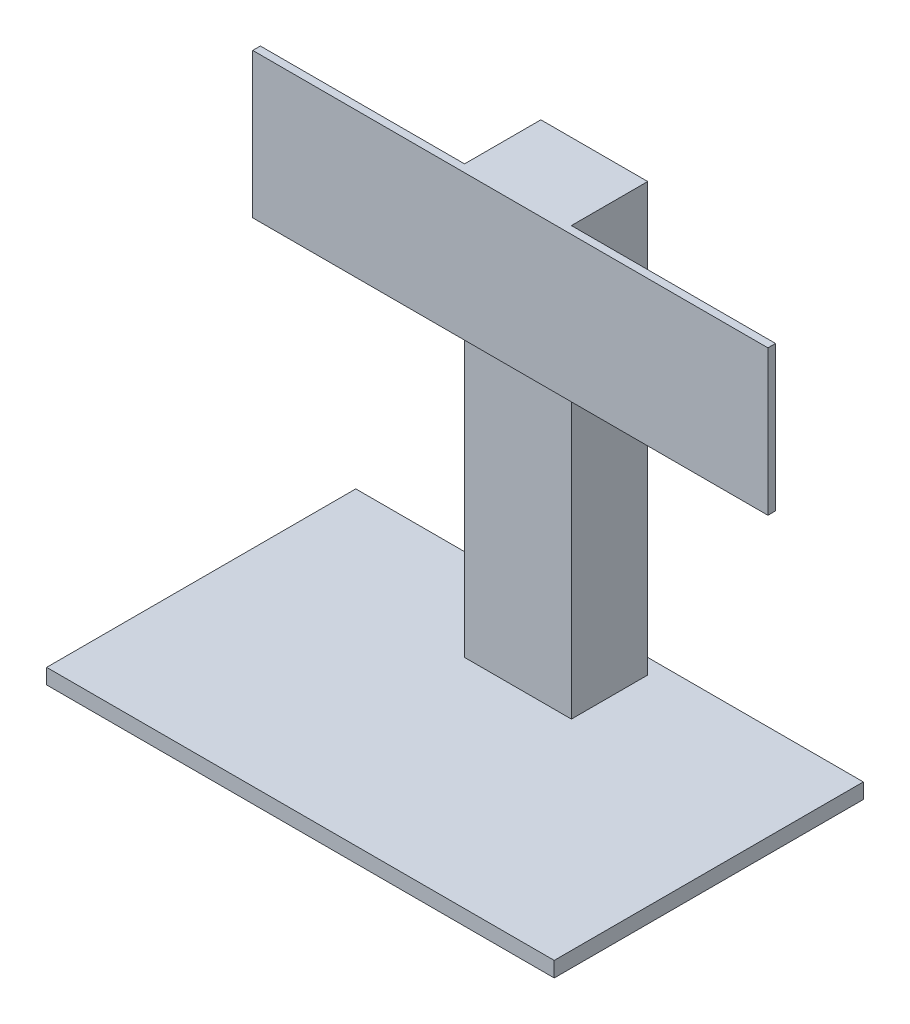
ISO-10303-21;
HEADER;
FILE_DESCRIPTION(('STEP AP214'),'2;1');
FILE_NAME('part.step','',(''),(''),'','','');
FILE_SCHEMA(('AUTOMOTIVE_DESIGN { 1 0 10303 214 1 1 1 1 }'));
ENDSEC;
DATA;
#1=APPLICATION_CONTEXT('core data for automotive mechanical design processes');
#2=APPLICATION_PROTOCOL_DEFINITION('international standard','automotive_design',2000,#1);
#3=PRODUCT_CONTEXT('',#1,'mechanical');
#4=PRODUCT('Part','Part','',(#3));
#5=PRODUCT_RELATED_PRODUCT_CATEGORY('part','',(#4));
#6=PRODUCT_DEFINITION_FORMATION('','',#4);
#7=PRODUCT_DEFINITION_CONTEXT('part definition',#1,'design');
#8=PRODUCT_DEFINITION('design','',#6,#7);
#9=PRODUCT_DEFINITION_SHAPE('','',#8);
#10=(LENGTH_UNIT() NAMED_UNIT(*) SI_UNIT(.MILLI.,.METRE.));
#11=(NAMED_UNIT(*) PLANE_ANGLE_UNIT() SI_UNIT($,.RADIAN.));
#12=(NAMED_UNIT(*) SI_UNIT($,.STERADIAN.) SOLID_ANGLE_UNIT());
#13=UNCERTAINTY_MEASURE_WITH_UNIT(LENGTH_MEASURE(1.E-05),#10,'distance_accuracy_value','');
#14=(GEOMETRIC_REPRESENTATION_CONTEXT(3) GLOBAL_UNCERTAINTY_ASSIGNED_CONTEXT((#13)) GLOBAL_UNIT_ASSIGNED_CONTEXT((#10,
#11,#12)) REPRESENTATION_CONTEXT('',''));
#15=CARTESIAN_POINT('',(0.,0.,0.));
#16=DIRECTION('',(0.,0.,1.));
#17=DIRECTION('',(1.,0.,0.));
#18=AXIS2_PLACEMENT_3D('',#15,#16,#17);
#19=CARTESIAN_POINT('',(-44.45,368.3,-52.3875));
#20=DIRECTION('',(0.,0.,-1.));
#21=DIRECTION('',(-1.,0.,0.));
#22=AXIS2_PLACEMENT_3D('',#19,#20,#21);
#23=PLANE('',#22);
#24=DIRECTION('',(1.,0.,0.));
#25=VECTOR('',#24,1.);
#26=CARTESIAN_POINT('',(-214.3125,247.65,-52.3875));
#27=LINE('',#26,#25);
#28=CARTESIAN_POINT('',(-44.45,247.65,-52.3875));
#29=VERTEX_POINT('',#28);
#30=CARTESIAN_POINT('',(44.45,247.65,-52.3875));
#31=VERTEX_POINT('',#30);
#32=EDGE_CURVE('E312',#29,#31,#27,.T.);
#33=ORIENTED_EDGE('',*,*,#32,.F.);
#34=DIRECTION('',(0.,-1.,0.));
#35=VECTOR('',#34,1.);
#36=CARTESIAN_POINT('',(-44.45,368.3,-52.3875));
#37=LINE('',#36,#35);
#38=CARTESIAN_POINT('',(-44.45,12.7,-52.3875));
#39=VERTEX_POINT('',#38);
#40=EDGE_CURVE('E58',#29,#39,#37,.T.);
#41=ORIENTED_EDGE('',*,*,#40,.T.);
#42=DIRECTION('',(1.,0.,0.));
#43=VECTOR('',#42,1.);
#44=CARTESIAN_POINT('',(-44.45,12.7,-52.3875));
#45=LINE('',#44,#43);
#46=CARTESIAN_POINT('',(44.45,12.7,-52.3875));
#47=VERTEX_POINT('',#46);
#48=EDGE_CURVE('E197',#39,#47,#45,.T.);
#49=ORIENTED_EDGE('',*,*,#48,.T.);
#50=DIRECTION('',(0.,-1.,0.));
#51=VECTOR('',#50,1.);
#52=CARTESIAN_POINT('',(44.45,368.3,-52.3875));
#53=LINE('',#52,#51);
#54=EDGE_CURVE('E203',#31,#47,#53,.T.);
#55=ORIENTED_EDGE('',*,*,#54,.F.);
#56=EDGE_LOOP('',(#33,#41,#49,#55));
#57=FACE_BOUND('',#56,.T.);
#58=ADVANCED_FACE('F41',(#57),#23,.F.);
#59=CARTESIAN_POINT('',(0.,12.7,0.));
#60=DIRECTION('',(0.,1.,0.));
#61=DIRECTION('',(0.,0.,1.));
#62=AXIS2_PLACEMENT_3D('',#59,#60,#61);
#63=PLANE('',#62);
#64=DIRECTION('',(0.,0.,1.));
#65=VECTOR('',#64,1.);
#66=CARTESIAN_POINT('',(-211.1375,12.7,128.5875));
#67=LINE('',#66,#65);
#68=CARTESIAN_POINT('',(-211.1375,12.7,-128.5875));
#69=VERTEX_POINT('',#68);
#70=CARTESIAN_POINT('',(-211.1375,12.7,128.5875));
#71=VERTEX_POINT('',#70);
#72=EDGE_CURVE('E227',#69,#71,#67,.T.);
#73=ORIENTED_EDGE('',*,*,#72,.T.);
#74=DIRECTION('',(1.,0.,0.));
#75=VECTOR('',#74,1.);
#76=CARTESIAN_POINT('',(211.1375,12.7,128.5875));
#77=LINE('',#76,#75);
#78=CARTESIAN_POINT('',(211.1375,12.7,128.5875));
#79=VERTEX_POINT('',#78);
#80=EDGE_CURVE('E95',#71,#79,#77,.T.);
#81=ORIENTED_EDGE('',*,*,#80,.T.);
#82=DIRECTION('',(0.,0.,-1.));
#83=VECTOR('',#82,1.);
#84=CARTESIAN_POINT('',(211.1375,12.7,128.5875));
#85=LINE('',#84,#83);
#86=CARTESIAN_POINT('',(211.1375,12.7,-128.5875));
#87=VERTEX_POINT('',#86);
#88=EDGE_CURVE('E231',#79,#87,#85,.T.);
#89=ORIENTED_EDGE('',*,*,#88,.T.);
#90=DIRECTION('',(-1.,0.,0.));
#91=VECTOR('',#90,1.);
#92=CARTESIAN_POINT('',(211.1375,12.7,-128.5875));
#93=LINE('',#92,#91);
#94=EDGE_CURVE('E67',#87,#69,#93,.T.);
#95=ORIENTED_EDGE('',*,*,#94,.T.);
#96=EDGE_LOOP('',(#73,#81,#89,#95));
#97=FACE_BOUND('',#96,.T.);
#98=DIRECTION('',(-1.,0.,0.));
#99=VECTOR('',#98,1.);
#100=CARTESIAN_POINT('',(-44.45,12.7,-115.8875));
#101=LINE('',#100,#99);
#102=CARTESIAN_POINT('',(44.45,12.7,-115.8875));
#103=VERTEX_POINT('',#102);
#104=CARTESIAN_POINT('',(-44.45,12.7,-115.8875));
#105=VERTEX_POINT('',#104);
#106=EDGE_CURVE('E187',#103,#105,#101,.T.);
#107=ORIENTED_EDGE('',*,*,#106,.F.);
#108=DIRECTION('',(0.,0.,-1.));
#109=VECTOR('',#108,1.);
#110=CARTESIAN_POINT('',(44.45,12.7,-52.3875));
#111=LINE('',#110,#109);
#112=EDGE_CURVE('E183',#47,#103,#111,.T.);
#113=ORIENTED_EDGE('',*,*,#112,.F.);
#114=ORIENTED_EDGE('',*,*,#48,.F.);
#115=DIRECTION('',(0.,0.,1.));
#116=VECTOR('',#115,1.);
#117=CARTESIAN_POINT('',(-44.45,12.7,-52.3875));
#118=LINE('',#117,#116);
#119=EDGE_CURVE('E207',#105,#39,#118,.T.);
#120=ORIENTED_EDGE('',*,*,#119,.F.);
#121=EDGE_LOOP('',(#107,#113,#114,#120));
#122=FACE_BOUND('',#121,.T.);
#123=ADVANCED_FACE('F271',(#97,#122),#63,.T.);
#124=CARTESIAN_POINT('',(-211.1375,12.7,128.5875));
#125=DIRECTION('',(1.,0.,0.));
#126=DIRECTION('',(0.,0.,-1.));
#127=AXIS2_PLACEMENT_3D('',#124,#125,#126);
#128=PLANE('',#127);
#129=DIRECTION('',(0.,0.,1.));
#130=VECTOR('',#129,1.);
#131=CARTESIAN_POINT('',(-211.1375,0.,128.5875));
#132=LINE('',#131,#130);
#133=CARTESIAN_POINT('',(-211.1375,0.,-128.5875));
#134=VERTEX_POINT('',#133);
#135=CARTESIAN_POINT('',(-211.1375,0.,128.5875));
#136=VERTEX_POINT('',#135);
#137=EDGE_CURVE('E226',#134,#136,#132,.T.);
#138=ORIENTED_EDGE('',*,*,#137,.T.);
#139=DIRECTION('',(0.,-1.,0.));
#140=VECTOR('',#139,1.);
#141=CARTESIAN_POINT('',(-211.1375,12.7,128.5875));
#142=LINE('',#141,#140);
#143=EDGE_CURVE('E11',#71,#136,#142,.T.);
#144=ORIENTED_EDGE('',*,*,#143,.F.);
#145=ORIENTED_EDGE('',*,*,#72,.F.);
#146=DIRECTION('',(0.,-1.,0.));
#147=VECTOR('',#146,1.);
#148=CARTESIAN_POINT('',(-211.1375,12.7,-128.5875));
#149=LINE('',#148,#147);
#150=EDGE_CURVE('E235',#69,#134,#149,.T.);
#151=ORIENTED_EDGE('',*,*,#150,.T.);
#152=EDGE_LOOP('',(#138,#144,#145,#151));
#153=FACE_BOUND('',#152,.T.);
#154=ADVANCED_FACE('F43',(#153),#128,.F.);
#155=CARTESIAN_POINT('',(211.1375,12.7,128.5875));
#156=DIRECTION('',(0.,0.,-1.));
#157=DIRECTION('',(-1.,0.,0.));
#158=AXIS2_PLACEMENT_3D('',#155,#156,#157);
#159=PLANE('',#158);
#160=DIRECTION('',(1.,0.,0.));
#161=VECTOR('',#160,1.);
#162=CARTESIAN_POINT('',(211.1375,0.,128.5875));
#163=LINE('',#162,#161);
#164=CARTESIAN_POINT('',(211.1375,0.,128.5875));
#165=VERTEX_POINT('',#164);
#166=EDGE_CURVE('E238',#136,#165,#163,.T.);
#167=ORIENTED_EDGE('',*,*,#166,.T.);
#168=DIRECTION('',(0.,-1.,0.));
#169=VECTOR('',#168,1.);
#170=CARTESIAN_POINT('',(211.1375,12.7,128.5875));
#171=LINE('',#170,#169);
#172=EDGE_CURVE('E49',#79,#165,#171,.T.);
#173=ORIENTED_EDGE('',*,*,#172,.F.);
#174=ORIENTED_EDGE('',*,*,#80,.F.);
#175=ORIENTED_EDGE('',*,*,#143,.T.);
#176=EDGE_LOOP('',(#167,#173,#174,#175));
#177=FACE_BOUND('',#176,.T.);
#178=ADVANCED_FACE('F268',(#177),#159,.F.);
#179=CARTESIAN_POINT('',(211.1375,12.7,128.5875));
#180=DIRECTION('',(-1.,0.,0.));
#181=DIRECTION('',(0.,0.,1.));
#182=AXIS2_PLACEMENT_3D('',#179,#180,#181);
#183=PLANE('',#182);
#184=DIRECTION('',(0.,0.,-1.));
#185=VECTOR('',#184,1.);
#186=CARTESIAN_POINT('',(211.1375,0.,128.5875));
#187=LINE('',#186,#185);
#188=CARTESIAN_POINT('',(211.1375,0.,-128.5875));
#189=VERTEX_POINT('',#188);
#190=EDGE_CURVE('E241',#165,#189,#187,.T.);
#191=ORIENTED_EDGE('',*,*,#190,.T.);
#192=DIRECTION('',(0.,-1.,0.));
#193=VECTOR('',#192,1.);
#194=CARTESIAN_POINT('',(211.1375,12.7,-128.5875));
#195=LINE('',#194,#193);
#196=EDGE_CURVE('E246',#87,#189,#195,.T.);
#197=ORIENTED_EDGE('',*,*,#196,.F.);
#198=ORIENTED_EDGE('',*,*,#88,.F.);
#199=ORIENTED_EDGE('',*,*,#172,.T.);
#200=EDGE_LOOP('',(#191,#197,#198,#199));
#201=FACE_BOUND('',#200,.T.);
#202=ADVANCED_FACE('F251',(#201),#183,.F.);
#203=CARTESIAN_POINT('',(211.1375,12.7,-128.5875));
#204=DIRECTION('',(0.,0.,1.));
#205=DIRECTION('',(1.,0.,0.));
#206=AXIS2_PLACEMENT_3D('',#203,#204,#205);
#207=PLANE('',#206);
#208=DIRECTION('',(-1.,0.,0.));
#209=VECTOR('',#208,1.);
#210=CARTESIAN_POINT('',(211.1375,0.,-128.5875));
#211=LINE('',#210,#209);
#212=EDGE_CURVE('E88',#189,#134,#211,.T.);
#213=ORIENTED_EDGE('',*,*,#212,.T.);
#214=ORIENTED_EDGE('',*,*,#150,.F.);
#215=ORIENTED_EDGE('',*,*,#94,.F.);
#216=ORIENTED_EDGE('',*,*,#196,.T.);
#217=EDGE_LOOP('',(#213,#214,#215,#216));
#218=FACE_BOUND('',#217,.T.);
#219=ADVANCED_FACE('F259',(#218),#207,.F.);
#220=CARTESIAN_POINT('',(0.,0.,0.));
#221=DIRECTION('',(0.,1.,0.));
#222=DIRECTION('',(0.,0.,1.));
#223=AXIS2_PLACEMENT_3D('',#220,#221,#222);
#224=PLANE('',#223);
#225=ORIENTED_EDGE('',*,*,#137,.F.);
#226=ORIENTED_EDGE('',*,*,#212,.F.);
#227=ORIENTED_EDGE('',*,*,#190,.F.);
#228=ORIENTED_EDGE('',*,*,#166,.F.);
#229=EDGE_LOOP('',(#225,#226,#227,#228));
#230=FACE_BOUND('',#229,.T.);
#231=ADVANCED_FACE('F255',(#230),#224,.F.);
#232=CARTESIAN_POINT('',(44.45,368.3,-52.3875));
#233=DIRECTION('',(-1.,0.,0.));
#234=DIRECTION('',(0.,0.,1.));
#235=AXIS2_PLACEMENT_3D('',#232,#233,#234);
#236=PLANE('',#235);
#237=ORIENTED_EDGE('',*,*,#112,.T.);
#238=DIRECTION('',(0.,-1.,0.));
#239=VECTOR('',#238,1.);
#240=CARTESIAN_POINT('',(44.45,368.3,-115.8875));
#241=LINE('',#240,#239);
#242=CARTESIAN_POINT('',(44.45,368.3,-115.8875));
#243=VERTEX_POINT('',#242);
#244=EDGE_CURVE('E223',#243,#103,#241,.T.);
#245=ORIENTED_EDGE('',*,*,#244,.F.);
#246=DIRECTION('',(0.,0.,-1.));
#247=VECTOR('',#246,1.);
#248=CARTESIAN_POINT('',(44.45,368.3,-52.3875));
#249=LINE('',#248,#247);
#250=CARTESIAN_POINT('',(44.45,368.3,-52.3875));
#251=VERTEX_POINT('',#250);
#252=EDGE_CURVE('E193',#251,#243,#249,.T.);
#253=ORIENTED_EDGE('',*,*,#252,.F.);
#254=EDGE_CURVE('E212',#251,#31,#53,.T.);
#255=ORIENTED_EDGE('',*,*,#254,.T.);
#256=ORIENTED_EDGE('',*,*,#54,.T.);
#257=EDGE_LOOP('',(#237,#245,#253,#255,#256));
#258=FACE_BOUND('',#257,.T.);
#259=ADVANCED_FACE('F266',(#258),#236,.F.);
#260=CARTESIAN_POINT('',(-44.45,368.3,-115.8875));
#261=DIRECTION('',(0.,0.,1.));
#262=DIRECTION('',(1.,0.,0.));
#263=AXIS2_PLACEMENT_3D('',#260,#261,#262);
#264=PLANE('',#263);
#265=ORIENTED_EDGE('',*,*,#106,.T.);
#266=DIRECTION('',(0.,-1.,0.));
#267=VECTOR('',#266,1.);
#268=CARTESIAN_POINT('',(-44.45,368.3,-115.8875));
#269=LINE('',#268,#267);
#270=CARTESIAN_POINT('',(-44.45,368.3,-115.8875));
#271=VERTEX_POINT('',#270);
#272=EDGE_CURVE('E219',#271,#105,#269,.T.);
#273=ORIENTED_EDGE('',*,*,#272,.F.);
#274=DIRECTION('',(-1.,0.,0.));
#275=VECTOR('',#274,1.);
#276=CARTESIAN_POINT('',(-44.45,368.3,-115.8875));
#277=LINE('',#276,#275);
#278=EDGE_CURVE('E196',#243,#271,#277,.T.);
#279=ORIENTED_EDGE('',*,*,#278,.F.);
#280=ORIENTED_EDGE('',*,*,#244,.T.);
#281=EDGE_LOOP('',(#265,#273,#279,#280));
#282=FACE_BOUND('',#281,.T.);
#283=ADVANCED_FACE('F283',(#282),#264,.F.);
#284=CARTESIAN_POINT('',(-44.45,368.3,-52.3875));
#285=DIRECTION('',(1.,0.,0.));
#286=DIRECTION('',(0.,0.,-1.));
#287=AXIS2_PLACEMENT_3D('',#284,#285,#286);
#288=PLANE('',#287);
#289=ORIENTED_EDGE('',*,*,#119,.T.);
#290=ORIENTED_EDGE('',*,*,#40,.F.);
#291=CARTESIAN_POINT('',(-44.45,368.3,-52.3875));
#292=VERTEX_POINT('',#291);
#293=EDGE_CURVE('E216',#292,#29,#37,.T.);
#294=ORIENTED_EDGE('',*,*,#293,.F.);
#295=DIRECTION('',(0.,0.,1.));
#296=VECTOR('',#295,1.);
#297=CARTESIAN_POINT('',(-44.45,368.3,-52.3875));
#298=LINE('',#297,#296);
#299=EDGE_CURVE('E200',#271,#292,#298,.T.);
#300=ORIENTED_EDGE('',*,*,#299,.F.);
#301=ORIENTED_EDGE('',*,*,#272,.T.);
#302=EDGE_LOOP('',(#289,#290,#294,#300,#301));
#303=FACE_BOUND('',#302,.T.);
#304=ADVANCED_FACE('F280',(#303),#288,.F.);
#305=CARTESIAN_POINT('',(0.,368.3,0.));
#306=DIRECTION('',(0.,-1.,0.));
#307=DIRECTION('',(0.,0.,-1.));
#308=AXIS2_PLACEMENT_3D('',#305,#306,#307);
#309=PLANE('',#308);
#310=ORIENTED_EDGE('',*,*,#252,.T.);
#311=ORIENTED_EDGE('',*,*,#278,.T.);
#312=ORIENTED_EDGE('',*,*,#299,.T.);
#313=DIRECTION('',(-1.,0.,0.));
#314=VECTOR('',#313,1.);
#315=CARTESIAN_POINT('',(-214.3125,368.3,-52.3875));
#316=LINE('',#315,#314);
#317=CARTESIAN_POINT('',(-214.3125,368.3,-52.3875));
#318=VERTEX_POINT('',#317);
#319=EDGE_CURVE('E303',#292,#318,#316,.T.);
#320=ORIENTED_EDGE('',*,*,#319,.T.);
#321=DIRECTION('',(0.,0.,-1.));
#322=VECTOR('',#321,1.);
#323=CARTESIAN_POINT('',(-214.3125,368.3,-46.0375));
#324=LINE('',#323,#322);
#325=CARTESIAN_POINT('',(-214.3125,368.3,-46.0375));
#326=VERTEX_POINT('',#325);
#327=EDGE_CURVE('E164',#326,#318,#324,.T.);
#328=ORIENTED_EDGE('',*,*,#327,.F.);
#329=DIRECTION('',(-1.,0.,0.));
#330=VECTOR('',#329,1.);
#331=CARTESIAN_POINT('',(-214.3125,368.3,-46.0375));
#332=LINE('',#331,#330);
#333=CARTESIAN_POINT('',(214.3125,368.3,-46.0375));
#334=VERTEX_POINT('',#333);
#335=EDGE_CURVE('E156',#334,#326,#332,.T.);
#336=ORIENTED_EDGE('',*,*,#335,.F.);
#337=DIRECTION('',(0.,0.,-1.));
#338=VECTOR('',#337,1.);
#339=CARTESIAN_POINT('',(214.3125,368.3,-46.0375));
#340=LINE('',#339,#338);
#341=CARTESIAN_POINT('',(214.3125,368.3,-52.3875));
#342=VERTEX_POINT('',#341);
#343=EDGE_CURVE('E161',#334,#342,#340,.T.);
#344=ORIENTED_EDGE('',*,*,#343,.T.);
#345=EDGE_CURVE('E304',#342,#251,#316,.T.);
#346=ORIENTED_EDGE('',*,*,#345,.T.);
#347=EDGE_LOOP('',(#310,#311,#312,#320,#328,#336,#344,#346));
#348=FACE_BOUND('',#347,.T.);
#349=ADVANCED_FACE('F159',(#348),#309,.F.);
#350=CARTESIAN_POINT('',(0.,0.,-52.3875));
#351=DIRECTION('',(0.,0.,-1.));
#352=DIRECTION('',(-1.,0.,0.));
#353=AXIS2_PLACEMENT_3D('',#350,#351,#352);
#354=PLANE('',#353);
#355=ORIENTED_EDGE('',*,*,#254,.F.);
#356=ORIENTED_EDGE('',*,*,#345,.F.);
#357=DIRECTION('',(0.,1.,0.));
#358=VECTOR('',#357,1.);
#359=CARTESIAN_POINT('',(214.3125,247.65,-52.3875));
#360=LINE('',#359,#358);
#361=CARTESIAN_POINT('',(214.3125,247.65,-52.3875));
#362=VERTEX_POINT('',#361);
#363=EDGE_CURVE('E182',#362,#342,#360,.T.);
#364=ORIENTED_EDGE('',*,*,#363,.F.);
#365=EDGE_CURVE('E308',#31,#362,#27,.T.);
#366=ORIENTED_EDGE('',*,*,#365,.F.);
#367=EDGE_LOOP('',(#355,#356,#364,#366));
#368=FACE_BOUND('',#367,.T.);
#369=ADVANCED_FACE('F307',(#368),#354,.T.);
#370=ORIENTED_EDGE('',*,*,#293,.T.);
#371=CARTESIAN_POINT('',(-214.3125,247.65,-52.3875));
#372=VERTEX_POINT('',#371);
#373=EDGE_CURVE('E178',#372,#29,#27,.T.);
#374=ORIENTED_EDGE('',*,*,#373,.F.);
#375=DIRECTION('',(0.,-1.,0.));
#376=VECTOR('',#375,1.);
#377=CARTESIAN_POINT('',(-214.3125,247.65,-52.3875));
#378=LINE('',#377,#376);
#379=EDGE_CURVE('E313',#318,#372,#378,.T.);
#380=ORIENTED_EDGE('',*,*,#379,.F.);
#381=ORIENTED_EDGE('',*,*,#319,.F.);
#382=EDGE_LOOP('',(#370,#374,#380,#381));
#383=FACE_BOUND('',#382,.T.);
#384=ADVANCED_FACE('F336',(#383),#354,.T.);
#385=CARTESIAN_POINT('',(214.3125,247.65,-46.0375));
#386=DIRECTION('',(-1.,0.,0.));
#387=DIRECTION('',(0.,0.,1.));
#388=AXIS2_PLACEMENT_3D('',#385,#386,#387);
#389=PLANE('',#388);
#390=ORIENTED_EDGE('',*,*,#363,.T.);
#391=ORIENTED_EDGE('',*,*,#343,.F.);
#392=DIRECTION('',(0.,1.,0.));
#393=VECTOR('',#392,1.);
#394=CARTESIAN_POINT('',(214.3125,247.65,-46.0375));
#395=LINE('',#394,#393);
#396=CARTESIAN_POINT('',(214.3125,247.65,-46.0375));
#397=VERTEX_POINT('',#396);
#398=EDGE_CURVE('E169',#397,#334,#395,.T.);
#399=ORIENTED_EDGE('',*,*,#398,.F.);
#400=DIRECTION('',(0.,0.,-1.));
#401=VECTOR('',#400,1.);
#402=CARTESIAN_POINT('',(214.3125,247.65,-46.0375));
#403=LINE('',#402,#401);
#404=EDGE_CURVE('E324',#397,#362,#403,.T.);
#405=ORIENTED_EDGE('',*,*,#404,.T.);
#406=EDGE_LOOP('',(#390,#391,#399,#405));
#407=FACE_BOUND('',#406,.T.);
#408=ADVANCED_FACE('F180',(#407),#389,.F.);
#409=CARTESIAN_POINT('',(-214.3125,247.65,-46.0375));
#410=DIRECTION('',(1.,0.,0.));
#411=DIRECTION('',(0.,0.,-1.));
#412=AXIS2_PLACEMENT_3D('',#409,#410,#411);
#413=PLANE('',#412);
#414=ORIENTED_EDGE('',*,*,#379,.T.);
#415=DIRECTION('',(0.,0.,-1.));
#416=VECTOR('',#415,1.);
#417=CARTESIAN_POINT('',(-214.3125,247.65,-46.0375));
#418=LINE('',#417,#416);
#419=CARTESIAN_POINT('',(-214.3125,247.65,-46.0375));
#420=VERTEX_POINT('',#419);
#421=EDGE_CURVE('E189',#420,#372,#418,.T.);
#422=ORIENTED_EDGE('',*,*,#421,.F.);
#423=DIRECTION('',(0.,-1.,0.));
#424=VECTOR('',#423,1.);
#425=CARTESIAN_POINT('',(-214.3125,247.65,-46.0375));
#426=LINE('',#425,#424);
#427=EDGE_CURVE('E168',#326,#420,#426,.T.);
#428=ORIENTED_EDGE('',*,*,#427,.F.);
#429=ORIENTED_EDGE('',*,*,#327,.T.);
#430=EDGE_LOOP('',(#414,#422,#428,#429));
#431=FACE_BOUND('',#430,.T.);
#432=ADVANCED_FACE('F337',(#431),#413,.F.);
#433=CARTESIAN_POINT('',(-214.3125,247.65,-46.0375));
#434=DIRECTION('',(0.,1.,0.));
#435=DIRECTION('',(0.,0.,1.));
#436=AXIS2_PLACEMENT_3D('',#433,#434,#435);
#437=PLANE('',#436);
#438=ORIENTED_EDGE('',*,*,#373,.T.);
#439=ORIENTED_EDGE('',*,*,#32,.T.);
#440=ORIENTED_EDGE('',*,*,#365,.T.);
#441=ORIENTED_EDGE('',*,*,#404,.F.);
#442=DIRECTION('',(1.,0.,0.));
#443=VECTOR('',#442,1.);
#444=CARTESIAN_POINT('',(-214.3125,247.65,-46.0375));
#445=LINE('',#444,#443);
#446=EDGE_CURVE('E174',#420,#397,#445,.T.);
#447=ORIENTED_EDGE('',*,*,#446,.F.);
#448=ORIENTED_EDGE('',*,*,#421,.T.);
#449=EDGE_LOOP('',(#438,#439,#440,#441,#447,#448));
#450=FACE_BOUND('',#449,.T.);
#451=ADVANCED_FACE('F316',(#450),#437,.F.);
#452=CARTESIAN_POINT('',(0.,0.,-46.0375));
#453=DIRECTION('',(0.,0.,-1.));
#454=DIRECTION('',(-1.,0.,0.));
#455=AXIS2_PLACEMENT_3D('',#452,#453,#454);
#456=PLANE('',#455);
#457=ORIENTED_EDGE('',*,*,#398,.T.);
#458=ORIENTED_EDGE('',*,*,#335,.T.);
#459=ORIENTED_EDGE('',*,*,#427,.T.);
#460=ORIENTED_EDGE('',*,*,#446,.T.);
#461=EDGE_LOOP('',(#457,#458,#459,#460));
#462=FACE_BOUND('',#461,.T.);
#463=ADVANCED_FACE('F172',(#462),#456,.F.);
#464=CLOSED_SHELL('',(#58,#123,#154,#178,#202,#219,#231,#259,#283,#304,#349,#369,#384,#408,#432,
#451,#463));
#465=MANIFOLD_SOLID_BREP('B2',#464);
#466=ADVANCED_BREP_SHAPE_REPRESENTATION('',(#18,#465),#14);
#467=SHAPE_DEFINITION_REPRESENTATION(#9,#466);
ENDSEC;
END-ISO-10303-21;
